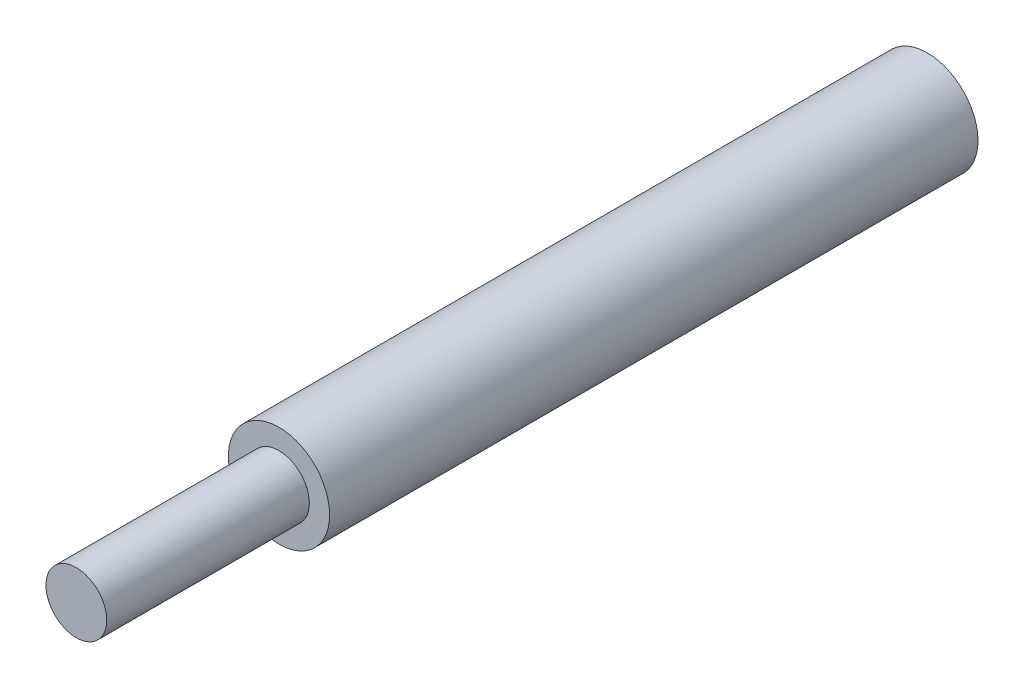
ISO-10303-21;
HEADER;
FILE_DESCRIPTION(('STEP AP214'),'2;1');
FILE_NAME('part.step','',(''),(''),'','','');
FILE_SCHEMA(('AUTOMOTIVE_DESIGN { 1 0 10303 214 1 1 1 1 }'));
ENDSEC;
DATA;
#1=APPLICATION_CONTEXT('core data for automotive mechanical design processes');
#2=APPLICATION_PROTOCOL_DEFINITION('international standard','automotive_design',2000,#1);
#3=PRODUCT_CONTEXT('',#1,'mechanical');
#4=PRODUCT('Part','Part','',(#3));
#5=PRODUCT_RELATED_PRODUCT_CATEGORY('part','',(#4));
#6=PRODUCT_DEFINITION_FORMATION('','',#4);
#7=PRODUCT_DEFINITION_CONTEXT('part definition',#1,'design');
#8=PRODUCT_DEFINITION('design','',#6,#7);
#9=PRODUCT_DEFINITION_SHAPE('','',#8);
#10=(LENGTH_UNIT() NAMED_UNIT(*) SI_UNIT(.MILLI.,.METRE.));
#11=(NAMED_UNIT(*) PLANE_ANGLE_UNIT() SI_UNIT($,.RADIAN.));
#12=(NAMED_UNIT(*) SI_UNIT($,.STERADIAN.) SOLID_ANGLE_UNIT());
#13=UNCERTAINTY_MEASURE_WITH_UNIT(LENGTH_MEASURE(1.E-05),#10,'distance_accuracy_value','');
#14=(GEOMETRIC_REPRESENTATION_CONTEXT(3) GLOBAL_UNCERTAINTY_ASSIGNED_CONTEXT((#13)) GLOBAL_UNIT_ASSIGNED_CONTEXT((#10,
#11,#12)) REPRESENTATION_CONTEXT('',''));
#15=CARTESIAN_POINT('',(0.,0.,0.));
#16=DIRECTION('',(0.,0.,1.));
#17=DIRECTION('',(1.,0.,0.));
#18=AXIS2_PLACEMENT_3D('',#15,#16,#17);
#19=CARTESIAN_POINT('',(0.,0.,80.));
#20=DIRECTION('',(0.,0.,-1.));
#21=DIRECTION('',(-1.,0.,0.));
#22=AXIS2_PLACEMENT_3D('',#19,#20,#21);
#23=CYLINDRICAL_SURFACE('',#22,12.5);
#24=CARTESIAN_POINT('',(0.,0.,80.));
#25=DIRECTION('',(0.,0.,1.));
#26=DIRECTION('',(1.,0.,0.));
#27=AXIS2_PLACEMENT_3D('',#24,#25,#26);
#28=CIRCLE('',#27,12.5);
#29=CARTESIAN_POINT('',(12.5,0.,80.));
#30=VERTEX_POINT('',#29);
#31=EDGE_CURVE('E43',#30,#30,#28,.T.);
#32=ORIENTED_EDGE('',*,*,#31,.F.);
#33=EDGE_LOOP('',(#32));
#34=FACE_BOUND('',#33,.T.);
#35=CARTESIAN_POINT('',(0.,0.,-80.));
#36=DIRECTION('',(0.,0.,1.));
#37=DIRECTION('',(1.,0.,0.));
#38=AXIS2_PLACEMENT_3D('',#35,#36,#37);
#39=CIRCLE('',#38,12.5);
#40=CARTESIAN_POINT('',(12.5,0.,-80.));
#41=VERTEX_POINT('',#40);
#42=EDGE_CURVE('E39',#41,#41,#39,.T.);
#43=ORIENTED_EDGE('',*,*,#42,.T.);
#44=EDGE_LOOP('',(#43));
#45=FACE_BOUND('',#44,.T.);
#46=ADVANCED_FACE('F36',(#34,#45),#23,.T.);
#47=CARTESIAN_POINT('',(0.,0.,80.));
#48=DIRECTION('',(0.,0.,1.));
#49=DIRECTION('',(1.,0.,0.));
#50=AXIS2_PLACEMENT_3D('',#47,#48,#49);
#51=PLANE('',#50);
#52=CARTESIAN_POINT('',(0.,0.,80.));
#53=DIRECTION('',(0.,0.,1.));
#54=DIRECTION('',(1.,0.,0.));
#55=AXIS2_PLACEMENT_3D('',#52,#53,#54);
#56=CIRCLE('',#55,7.5);
#57=CARTESIAN_POINT('',(7.5,0.,80.));
#58=VERTEX_POINT('',#57);
#59=EDGE_CURVE('E10',#58,#58,#56,.T.);
#60=ORIENTED_EDGE('',*,*,#59,.F.);
#61=EDGE_LOOP('',(#60));
#62=FACE_BOUND('',#61,.T.);
#63=ORIENTED_EDGE('',*,*,#31,.T.);
#64=EDGE_LOOP('',(#63));
#65=FACE_BOUND('',#64,.T.);
#66=ADVANCED_FACE('F60',(#62,#65),#51,.T.);
#67=CARTESIAN_POINT('',(0.,0.,-80.));
#68=DIRECTION('',(0.,0.,1.));
#69=DIRECTION('',(1.,0.,0.));
#70=AXIS2_PLACEMENT_3D('',#67,#68,#69);
#71=PLANE('',#70);
#72=ORIENTED_EDGE('',*,*,#42,.F.);
#73=EDGE_LOOP('',(#72));
#74=FACE_BOUND('',#73,.T.);
#75=ADVANCED_FACE('F57',(#74),#71,.F.);
#76=CARTESIAN_POINT('',(0.,0.,130.));
#77=DIRECTION('',(0.,0.,-1.));
#78=DIRECTION('',(-1.,0.,0.));
#79=AXIS2_PLACEMENT_3D('',#76,#77,#78);
#80=CYLINDRICAL_SURFACE('',#79,7.5);
#81=CARTESIAN_POINT('',(0.,0.,130.));
#82=DIRECTION('',(0.,0.,1.));
#83=DIRECTION('',(1.,0.,0.));
#84=AXIS2_PLACEMENT_3D('',#81,#82,#83);
#85=CIRCLE('',#84,7.5);
#86=CARTESIAN_POINT('',(7.5,0.,130.));
#87=VERTEX_POINT('',#86);
#88=EDGE_CURVE('E49',#87,#87,#85,.T.);
#89=ORIENTED_EDGE('',*,*,#88,.F.);
#90=EDGE_LOOP('',(#89));
#91=FACE_BOUND('',#90,.T.);
#92=ORIENTED_EDGE('',*,*,#59,.T.);
#93=EDGE_LOOP('',(#92));
#94=FACE_BOUND('',#93,.T.);
#95=ADVANCED_FACE('F59',(#91,#94),#80,.T.);
#96=CARTESIAN_POINT('',(0.,0.,130.));
#97=DIRECTION('',(0.,0.,1.));
#98=DIRECTION('',(1.,0.,0.));
#99=AXIS2_PLACEMENT_3D('',#96,#97,#98);
#100=PLANE('',#99);
#101=ORIENTED_EDGE('',*,*,#88,.T.);
#102=EDGE_LOOP('',(#101));
#103=FACE_BOUND('',#102,.T.);
#104=ADVANCED_FACE('F65',(#103),#100,.T.);
#105=CLOSED_SHELL('',(#46,#66,#75,#95,#104));
#106=MANIFOLD_SOLID_BREP('B2',#105);
#107=ADVANCED_BREP_SHAPE_REPRESENTATION('',(#18,#106),#14);
#108=SHAPE_DEFINITION_REPRESENTATION(#9,#107);
ENDSEC;
END-ISO-10303-21;
